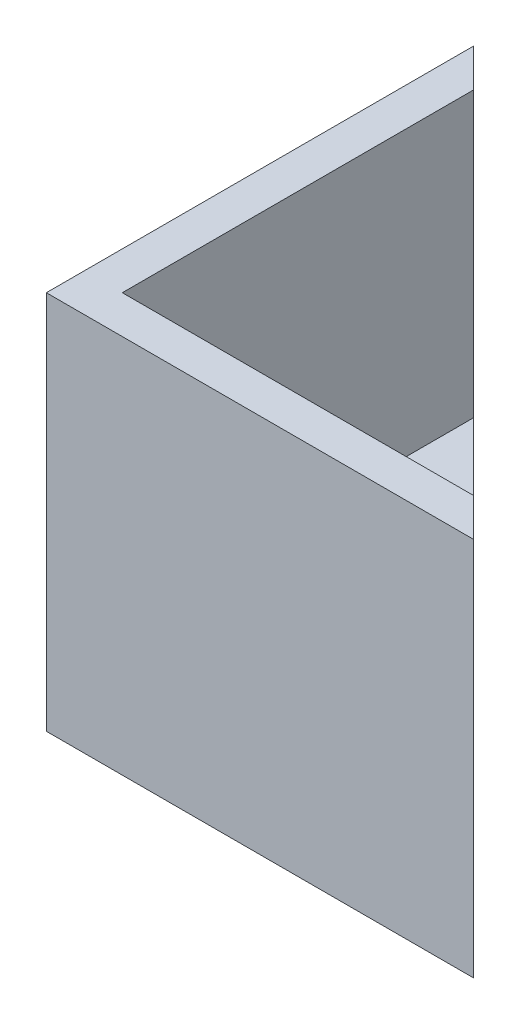
ISO-10303-21;
HEADER;
FILE_DESCRIPTION(('STEP AP214'),'2;1');
FILE_NAME('part.step','',(''),(''),'','','');
FILE_SCHEMA(('AUTOMOTIVE_DESIGN { 1 0 10303 214 1 1 1 1 }'));
ENDSEC;
DATA;
#1=APPLICATION_CONTEXT('core data for automotive mechanical design processes');
#2=APPLICATION_PROTOCOL_DEFINITION('international standard','automotive_design',2000,#1);
#3=PRODUCT_CONTEXT('',#1,'mechanical');
#4=PRODUCT('Part','Part','',(#3));
#5=PRODUCT_RELATED_PRODUCT_CATEGORY('part','',(#4));
#6=PRODUCT_DEFINITION_FORMATION('','',#4);
#7=PRODUCT_DEFINITION_CONTEXT('part definition',#1,'design');
#8=PRODUCT_DEFINITION('design','',#6,#7);
#9=PRODUCT_DEFINITION_SHAPE('','',#8);
#10=(LENGTH_UNIT() NAMED_UNIT(*) SI_UNIT(.MILLI.,.METRE.));
#11=(NAMED_UNIT(*) PLANE_ANGLE_UNIT() SI_UNIT($,.RADIAN.));
#12=(NAMED_UNIT(*) SI_UNIT($,.STERADIAN.) SOLID_ANGLE_UNIT());
#13=UNCERTAINTY_MEASURE_WITH_UNIT(LENGTH_MEASURE(1.E-05),#10,'distance_accuracy_value','');
#14=(GEOMETRIC_REPRESENTATION_CONTEXT(3) GLOBAL_UNCERTAINTY_ASSIGNED_CONTEXT((#13)) GLOBAL_UNIT_ASSIGNED_CONTEXT((#10,
#11,#12)) REPRESENTATION_CONTEXT('',''));
#15=CARTESIAN_POINT('',(0.,0.,0.));
#16=DIRECTION('',(0.,0.,1.));
#17=DIRECTION('',(1.,0.,0.));
#18=AXIS2_PLACEMENT_3D('',#15,#16,#17);
#19=CARTESIAN_POINT('',(0.,10.1,0.));
#20=DIRECTION('',(0.,1.,0.));
#21=DIRECTION('',(0.,0.,1.));
#22=AXIS2_PLACEMENT_3D('',#19,#20,#21);
#23=PLANE('',#22);
#24=DIRECTION('',(-0.707106781186548,0.,-0.707106781186547));
#25=VECTOR('',#24,1.);
#26=CARTESIAN_POINT('',(12.5355339059327,10.1,-28.221825406948));
#27=LINE('',#26,#25);
#28=CARTESIAN_POINT('',(28.221825406948,10.1,-12.5355339059327));
#29=VERTEX_POINT('',#28);
#30=CARTESIAN_POINT('',(12.5355339059327,10.1,-28.221825406948));
#31=VERTEX_POINT('',#30);
#32=EDGE_CURVE('E180',#29,#31,#27,.T.);
#33=ORIENTED_EDGE('',*,*,#32,.F.);
#34=CARTESIAN_POINT('',(24.6862915010152,10.1,-9.));
#35=DIRECTION('',(0.,1.,0.));
#36=DIRECTION('',(0.,0.,1.));
#37=AXIS2_PLACEMENT_3D('',#34,#35,#36);
#38=CIRCLE('',#37,5.);
#39=CARTESIAN_POINT('',(24.6862915010152,10.1,-4.));
#40=VERTEX_POINT('',#39);
#41=EDGE_CURVE('E195',#40,#29,#38,.T.);
#42=ORIENTED_EDGE('',*,*,#41,.F.);
#43=DIRECTION('',(-1.,0.,0.));
#44=VECTOR('',#43,1.);
#45=CARTESIAN_POINT('',(41.,10.1,-4.));
#46=LINE('',#45,#44);
#47=CARTESIAN_POINT('',(41.,10.1,-4.));
#48=VERTEX_POINT('',#47);
#49=EDGE_CURVE('E226',#48,#40,#46,.T.);
#50=ORIENTED_EDGE('',*,*,#49,.F.);
#51=DIRECTION('',(-0.707106781186548,0.,-0.707106781186548));
#52=VECTOR('',#51,1.);
#53=CARTESIAN_POINT('',(45.,10.1,0.));
#54=LINE('',#53,#52);
#55=CARTESIAN_POINT('',(4.,10.1,-41.));
#56=VERTEX_POINT('',#55);
#57=EDGE_CURVE('E241',#48,#56,#54,.T.);
#58=ORIENTED_EDGE('',*,*,#57,.T.);
#59=DIRECTION('',(0.,0.,-1.));
#60=VECTOR('',#59,1.);
#61=CARTESIAN_POINT('',(4.,10.1,-4.));
#62=LINE('',#61,#60);
#63=CARTESIAN_POINT('',(4.,10.1,-24.6862915010152));
#64=VERTEX_POINT('',#63);
#65=EDGE_CURVE('E229',#64,#56,#62,.T.);
#66=ORIENTED_EDGE('',*,*,#65,.F.);
#67=CARTESIAN_POINT('',(9.,10.1,-24.6862915010152));
#68=DIRECTION('',(0.,1.,0.));
#69=DIRECTION('',(0.,0.,1.));
#70=AXIS2_PLACEMENT_3D('',#67,#68,#69);
#71=CIRCLE('',#70,4.99999999999999);
#72=EDGE_CURVE('E190',#31,#64,#71,.T.);
#73=ORIENTED_EDGE('',*,*,#72,.F.);
#74=EDGE_LOOP('',(#33,#42,#50,#58,#66,#73));
#75=FACE_BOUND('',#74,.T.);
#76=ADVANCED_FACE('F41',(#75),#23,.T.);
#77=CARTESIAN_POINT('',(0.,10.1,-45.));
#78=DIRECTION('',(1.,0.,0.));
#79=DIRECTION('',(0.,0.,-1.));
#80=AXIS2_PLACEMENT_3D('',#77,#78,#79);
#81=PLANE('',#80);
#82=DIRECTION('',(0.,0.,1.));
#83=VECTOR('',#82,1.);
#84=CARTESIAN_POINT('',(0.,0.,-45.));
#85=LINE('',#84,#83);
#86=CARTESIAN_POINT('',(0.,0.,-45.));
#87=VERTEX_POINT('',#86);
#88=CARTESIAN_POINT('',(0.,0.,0.));
#89=VERTEX_POINT('',#88);
#90=EDGE_CURVE('E240',#87,#89,#85,.T.);
#91=ORIENTED_EDGE('',*,*,#90,.T.);
#92=DIRECTION('',(0.,-1.,0.));
#93=VECTOR('',#92,1.);
#94=CARTESIAN_POINT('',(0.,10.1,0.));
#95=LINE('',#94,#93);
#96=CARTESIAN_POINT('',(0.,40.,0.));
#97=VERTEX_POINT('',#96);
#98=EDGE_CURVE('E256',#97,#89,#95,.T.);
#99=ORIENTED_EDGE('',*,*,#98,.F.);
#100=DIRECTION('',(0.,0.,1.));
#101=VECTOR('',#100,1.);
#102=CARTESIAN_POINT('',(0.,40.,-45.));
#103=LINE('',#102,#101);
#104=CARTESIAN_POINT('',(0.,40.,-45.));
#105=VERTEX_POINT('',#104);
#106=EDGE_CURVE('E209',#105,#97,#103,.T.);
#107=ORIENTED_EDGE('',*,*,#106,.F.);
#108=DIRECTION('',(0.,-1.,0.));
#109=VECTOR('',#108,1.);
#110=CARTESIAN_POINT('',(0.,10.1,-45.));
#111=LINE('',#110,#109);
#112=EDGE_CURVE('E244',#105,#87,#111,.T.);
#113=ORIENTED_EDGE('',*,*,#112,.T.);
#114=EDGE_LOOP('',(#91,#99,#107,#113));
#115=FACE_BOUND('',#114,.T.);
#116=ADVANCED_FACE('F43',(#115),#81,.F.);
#117=CARTESIAN_POINT('',(0.,10.1,0.));
#118=DIRECTION('',(0.,0.,-1.));
#119=DIRECTION('',(-1.,0.,0.));
#120=AXIS2_PLACEMENT_3D('',#117,#118,#119);
#121=PLANE('',#120);
#122=DIRECTION('',(1.,0.,0.));
#123=VECTOR('',#122,1.);
#124=CARTESIAN_POINT('',(0.,0.,0.));
#125=LINE('',#124,#123);
#126=CARTESIAN_POINT('',(45.,0.,0.));
#127=VERTEX_POINT('',#126);
#128=EDGE_CURVE('E248',#89,#127,#125,.T.);
#129=ORIENTED_EDGE('',*,*,#128,.T.);
#130=DIRECTION('',(0.,-1.,0.));
#131=VECTOR('',#130,1.);
#132=CARTESIAN_POINT('',(45.,10.1,0.));
#133=LINE('',#132,#131);
#134=CARTESIAN_POINT('',(45.,40.,0.));
#135=VERTEX_POINT('',#134);
#136=EDGE_CURVE('E253',#135,#127,#133,.T.);
#137=ORIENTED_EDGE('',*,*,#136,.F.);
#138=DIRECTION('',(1.,0.,0.));
#139=VECTOR('',#138,1.);
#140=CARTESIAN_POINT('',(0.,40.,0.));
#141=LINE('',#140,#139);
#142=EDGE_CURVE('E212',#97,#135,#141,.T.);
#143=ORIENTED_EDGE('',*,*,#142,.F.);
#144=ORIENTED_EDGE('',*,*,#98,.T.);
#145=EDGE_LOOP('',(#129,#137,#143,#144));
#146=FACE_BOUND('',#145,.T.);
#147=ADVANCED_FACE('F285',(#146),#121,.F.);
#148=CARTESIAN_POINT('',(45.,10.1,0.));
#149=DIRECTION('',(-0.707106781186548,0.,0.707106781186548));
#150=DIRECTION('',(0.707106781186548,0.,0.707106781186548));
#151=AXIS2_PLACEMENT_3D('',#148,#149,#150);
#152=PLANE('',#151);
#153=DIRECTION('',(-0.707106781186548,0.,-0.707106781186548));
#154=VECTOR('',#153,1.);
#155=CARTESIAN_POINT('',(45.,0.,0.));
#156=LINE('',#155,#154);
#157=EDGE_CURVE('E245',#127,#87,#156,.T.);
#158=ORIENTED_EDGE('',*,*,#157,.T.);
#159=ORIENTED_EDGE('',*,*,#112,.F.);
#160=DIRECTION('',(-0.707106781186548,0.,-0.707106781186547));
#161=VECTOR('',#160,1.);
#162=CARTESIAN_POINT('',(4.,40.,-41.));
#163=LINE('',#162,#161);
#164=CARTESIAN_POINT('',(4.,40.,-41.));
#165=VERTEX_POINT('',#164);
#166=EDGE_CURVE('E222',#165,#105,#163,.T.);
#167=ORIENTED_EDGE('',*,*,#166,.F.);
#168=DIRECTION('',(0.,-1.,0.));
#169=VECTOR('',#168,1.);
#170=CARTESIAN_POINT('',(4.,40.,-41.));
#171=LINE('',#170,#169);
#172=EDGE_CURVE('E225',#165,#56,#171,.T.);
#173=ORIENTED_EDGE('',*,*,#172,.T.);
#174=ORIENTED_EDGE('',*,*,#57,.F.);
#175=DIRECTION('',(0.,-1.,0.));
#176=VECTOR('',#175,1.);
#177=CARTESIAN_POINT('',(41.,40.,-4.));
#178=LINE('',#177,#176);
#179=CARTESIAN_POINT('',(41.,40.,-4.));
#180=VERTEX_POINT('',#179);
#181=EDGE_CURVE('E237',#180,#48,#178,.T.);
#182=ORIENTED_EDGE('',*,*,#181,.F.);
#183=DIRECTION('',(-0.707106781186548,0.,-0.707106781186547));
#184=VECTOR('',#183,1.);
#185=CARTESIAN_POINT('',(45.,40.,0.));
#186=LINE('',#185,#184);
#187=EDGE_CURVE('E216',#135,#180,#186,.T.);
#188=ORIENTED_EDGE('',*,*,#187,.F.);
#189=ORIENTED_EDGE('',*,*,#136,.T.);
#190=EDGE_LOOP('',(#158,#159,#167,#173,#174,#182,#188,#189));
#191=FACE_BOUND('',#190,.T.);
#192=ADVANCED_FACE('F291',(#191),#152,.F.);
#193=CARTESIAN_POINT('',(5.46446609406727,10.1,-21.1507575950825));
#194=VERTEX_POINT('',#193);
#195=EDGE_CURVE('E171',#64,#194,#71,.T.);
#196=ORIENTED_EDGE('',*,*,#195,.F.);
#197=CARTESIAN_POINT('',(4.,10.1,-4.));
#198=VERTEX_POINT('',#197);
#199=EDGE_CURVE('E213',#198,#64,#62,.T.);
#200=ORIENTED_EDGE('',*,*,#199,.F.);
#201=EDGE_CURVE('E202',#40,#198,#46,.T.);
#202=ORIENTED_EDGE('',*,*,#201,.F.);
#203=CARTESIAN_POINT('',(21.1507575950825,10.1,-5.46446609406727));
#204=VERTEX_POINT('',#203);
#205=EDGE_CURVE('E196',#204,#40,#38,.T.);
#206=ORIENTED_EDGE('',*,*,#205,.F.);
#207=DIRECTION('',(0.707106781186547,0.,0.707106781186547));
#208=VECTOR('',#207,1.);
#209=CARTESIAN_POINT('',(5.46446609406727,10.1,-21.1507575950825));
#210=LINE('',#209,#208);
#211=EDGE_CURVE('E192',#194,#204,#210,.T.);
#212=ORIENTED_EDGE('',*,*,#211,.F.);
#213=EDGE_LOOP('',(#196,#200,#202,#206,#212));
#214=FACE_BOUND('',#213,.T.);
#215=ADVANCED_FACE('F281',(#214),#23,.T.);
#216=CARTESIAN_POINT('',(0.,0.,0.));
#217=DIRECTION('',(0.,1.,0.));
#218=DIRECTION('',(0.,0.,1.));
#219=AXIS2_PLACEMENT_3D('',#216,#217,#218);
#220=PLANE('',#219);
#221=DIRECTION('',(-0.707106781186547,0.,-0.707106781186547));
#222=VECTOR('',#221,1.);
#223=CARTESIAN_POINT('',(10.944543648263,0.,-26.6308351492782));
#224=LINE('',#223,#222);
#225=CARTESIAN_POINT('',(26.6308351492783,0.,-10.944543648263));
#226=VERTEX_POINT('',#225);
#227=CARTESIAN_POINT('',(10.944543648263,0.,-26.6308351492782));
#228=VERTEX_POINT('',#227);
#229=EDGE_CURVE('E155',#226,#228,#224,.T.);
#230=ORIENTED_EDGE('',*,*,#229,.T.);
#231=CARTESIAN_POINT('',(9.,0.,-24.6862915010152));
#232=DIRECTION('',(0.,1.,0.));
#233=DIRECTION('',(0.,0.,1.));
#234=AXIS2_PLACEMENT_3D('',#231,#232,#233);
#235=CIRCLE('',#234,2.75);
#236=CARTESIAN_POINT('',(7.055456351737,0.,-22.7417478527522));
#237=VERTEX_POINT('',#236);
#238=EDGE_CURVE('E150',#228,#237,#235,.T.);
#239=ORIENTED_EDGE('',*,*,#238,.T.);
#240=DIRECTION('',(0.707106781186548,0.,0.707106781186547));
#241=VECTOR('',#240,1.);
#242=CARTESIAN_POINT('',(7.055456351737,0.,-22.7417478527522));
#243=LINE('',#242,#241);
#244=CARTESIAN_POINT('',(22.7417478527522,0.,-7.055456351737));
#245=VERTEX_POINT('',#244);
#246=EDGE_CURVE('E158',#237,#245,#243,.T.);
#247=ORIENTED_EDGE('',*,*,#246,.T.);
#248=CARTESIAN_POINT('',(24.6862915010152,0.,-9.));
#249=DIRECTION('',(0.,1.,0.));
#250=DIRECTION('',(0.,0.,1.));
#251=AXIS2_PLACEMENT_3D('',#248,#249,#250);
#252=CIRCLE('',#251,2.75);
#253=EDGE_CURVE('E56',#245,#226,#252,.T.);
#254=ORIENTED_EDGE('',*,*,#253,.T.);
#255=EDGE_LOOP('',(#230,#239,#247,#254));
#256=FACE_BOUND('',#255,.T.);
#257=ORIENTED_EDGE('',*,*,#90,.F.);
#258=ORIENTED_EDGE('',*,*,#157,.F.);
#259=ORIENTED_EDGE('',*,*,#128,.F.);
#260=EDGE_LOOP('',(#257,#258,#259));
#261=FACE_BOUND('',#260,.T.);
#262=ADVANCED_FACE('F162',(#256,#261),#220,.F.);
#263=CARTESIAN_POINT('',(41.,40.,-4.));
#264=DIRECTION('',(0.,0.,1.));
#265=DIRECTION('',(1.,0.,0.));
#266=AXIS2_PLACEMENT_3D('',#263,#264,#265);
#267=PLANE('',#266);
#268=ORIENTED_EDGE('',*,*,#49,.T.);
#269=ORIENTED_EDGE('',*,*,#201,.T.);
#270=DIRECTION('',(0.,-1.,0.));
#271=VECTOR('',#270,1.);
#272=CARTESIAN_POINT('',(4.,40.,-4.));
#273=LINE('',#272,#271);
#274=CARTESIAN_POINT('',(4.,40.,-4.));
#275=VERTEX_POINT('',#274);
#276=EDGE_CURVE('E234',#275,#198,#273,.T.);
#277=ORIENTED_EDGE('',*,*,#276,.F.);
#278=DIRECTION('',(-1.,0.,0.));
#279=VECTOR('',#278,1.);
#280=CARTESIAN_POINT('',(41.,40.,-4.));
#281=LINE('',#280,#279);
#282=EDGE_CURVE('E218',#180,#275,#281,.T.);
#283=ORIENTED_EDGE('',*,*,#282,.F.);
#284=ORIENTED_EDGE('',*,*,#181,.T.);
#285=EDGE_LOOP('',(#268,#269,#277,#283,#284));
#286=FACE_BOUND('',#285,.T.);
#287=ADVANCED_FACE('F297',(#286),#267,.F.);
#288=CARTESIAN_POINT('',(4.,40.,-4.));
#289=DIRECTION('',(-1.,0.,0.));
#290=DIRECTION('',(0.,0.,1.));
#291=AXIS2_PLACEMENT_3D('',#288,#289,#290);
#292=PLANE('',#291);
#293=ORIENTED_EDGE('',*,*,#199,.T.);
#294=ORIENTED_EDGE('',*,*,#65,.T.);
#295=ORIENTED_EDGE('',*,*,#172,.F.);
#296=DIRECTION('',(0.,0.,-1.));
#297=VECTOR('',#296,1.);
#298=CARTESIAN_POINT('',(4.,40.,-4.));
#299=LINE('',#298,#297);
#300=EDGE_CURVE('E220',#275,#165,#299,.T.);
#301=ORIENTED_EDGE('',*,*,#300,.F.);
#302=ORIENTED_EDGE('',*,*,#276,.T.);
#303=EDGE_LOOP('',(#293,#294,#295,#301,#302));
#304=FACE_BOUND('',#303,.T.);
#305=ADVANCED_FACE('F312',(#304),#292,.F.);
#306=CARTESIAN_POINT('',(0.,40.,0.));
#307=DIRECTION('',(0.,1.,0.));
#308=DIRECTION('',(0.,0.,1.));
#309=AXIS2_PLACEMENT_3D('',#306,#307,#308);
#310=PLANE('',#309);
#311=ORIENTED_EDGE('',*,*,#106,.T.);
#312=ORIENTED_EDGE('',*,*,#142,.T.);
#313=ORIENTED_EDGE('',*,*,#187,.T.);
#314=ORIENTED_EDGE('',*,*,#282,.T.);
#315=ORIENTED_EDGE('',*,*,#300,.T.);
#316=ORIENTED_EDGE('',*,*,#166,.T.);
#317=EDGE_LOOP('',(#311,#312,#313,#314,#315,#316));
#318=FACE_BOUND('',#317,.T.);
#319=ADVANCED_FACE('F330',(#318),#310,.T.);
#320=CARTESIAN_POINT('',(9.,4.,-24.6862915010152));
#321=DIRECTION('',(0.,1.,0.));
#322=DIRECTION('',(0.,0.,1.));
#323=AXIS2_PLACEMENT_3D('',#320,#321,#322);
#324=CYLINDRICAL_SURFACE('',#323,4.99999999999999);
#325=ORIENTED_EDGE('',*,*,#72,.T.);
#326=ORIENTED_EDGE('',*,*,#195,.T.);
#327=DIRECTION('',(0.,1.,0.));
#328=VECTOR('',#327,1.);
#329=CARTESIAN_POINT('',(5.46446609406727,4.,-21.1507575950825));
#330=LINE('',#329,#328);
#331=CARTESIAN_POINT('',(5.46446609406727,4.,-21.1507575950825));
#332=VERTEX_POINT('',#331);
#333=EDGE_CURVE('E189',#332,#194,#330,.T.);
#334=ORIENTED_EDGE('',*,*,#333,.F.);
#335=CARTESIAN_POINT('',(9.,4.,-24.6862915010152));
#336=DIRECTION('',(0.,1.,0.));
#337=DIRECTION('',(0.,0.,1.));
#338=AXIS2_PLACEMENT_3D('',#335,#336,#337);
#339=CIRCLE('',#338,4.99999999999999);
#340=CARTESIAN_POINT('',(12.5355339059327,4.,-28.221825406948));
#341=VERTEX_POINT('',#340);
#342=EDGE_CURVE('E176',#341,#332,#339,.T.);
#343=ORIENTED_EDGE('',*,*,#342,.F.);
#344=DIRECTION('',(0.,1.,0.));
#345=VECTOR('',#344,1.);
#346=CARTESIAN_POINT('',(12.5355339059327,4.,-28.221825406948));
#347=LINE('',#346,#345);
#348=EDGE_CURVE('E200',#341,#31,#347,.T.);
#349=ORIENTED_EDGE('',*,*,#348,.T.);
#350=EDGE_LOOP('',(#325,#326,#334,#343,#349));
#351=FACE_BOUND('',#350,.T.);
#352=ADVANCED_FACE('F328',(#351),#324,.F.);
#353=CARTESIAN_POINT('',(12.5355339059327,4.,-28.221825406948));
#354=DIRECTION('',(0.707106781186547,0.,-0.707106781186548));
#355=DIRECTION('',(-0.707106781186548,0.,-0.707106781186547));
#356=AXIS2_PLACEMENT_3D('',#353,#354,#355);
#357=PLANE('',#356);
#358=ORIENTED_EDGE('',*,*,#32,.T.);
#359=ORIENTED_EDGE('',*,*,#348,.F.);
#360=DIRECTION('',(-0.707106781186548,0.,-0.707106781186547));
#361=VECTOR('',#360,1.);
#362=CARTESIAN_POINT('',(12.5355339059327,4.,-28.221825406948));
#363=LINE('',#362,#361);
#364=CARTESIAN_POINT('',(28.221825406948,4.,-12.5355339059327));
#365=VERTEX_POINT('',#364);
#366=EDGE_CURVE('E186',#365,#341,#363,.T.);
#367=ORIENTED_EDGE('',*,*,#366,.F.);
#368=DIRECTION('',(0.,1.,0.));
#369=VECTOR('',#368,1.);
#370=CARTESIAN_POINT('',(28.221825406948,4.,-12.5355339059327));
#371=LINE('',#370,#369);
#372=EDGE_CURVE('E203',#365,#29,#371,.T.);
#373=ORIENTED_EDGE('',*,*,#372,.T.);
#374=EDGE_LOOP('',(#358,#359,#367,#373));
#375=FACE_BOUND('',#374,.T.);
#376=ADVANCED_FACE('F322',(#375),#357,.F.);
#377=CARTESIAN_POINT('',(24.6862915010152,4.,-9.));
#378=DIRECTION('',(0.,1.,0.));
#379=DIRECTION('',(0.,0.,1.));
#380=AXIS2_PLACEMENT_3D('',#377,#378,#379);
#381=CYLINDRICAL_SURFACE('',#380,5.);
#382=ORIENTED_EDGE('',*,*,#205,.T.);
#383=ORIENTED_EDGE('',*,*,#41,.T.);
#384=ORIENTED_EDGE('',*,*,#372,.F.);
#385=CARTESIAN_POINT('',(24.6862915010152,4.,-9.));
#386=DIRECTION('',(0.,1.,0.));
#387=DIRECTION('',(0.,0.,1.));
#388=AXIS2_PLACEMENT_3D('',#385,#386,#387);
#389=CIRCLE('',#388,5.);
#390=CARTESIAN_POINT('',(21.1507575950825,4.,-5.46446609406727));
#391=VERTEX_POINT('',#390);
#392=EDGE_CURVE('E183',#391,#365,#389,.T.);
#393=ORIENTED_EDGE('',*,*,#392,.F.);
#394=DIRECTION('',(0.,1.,0.));
#395=VECTOR('',#394,1.);
#396=CARTESIAN_POINT('',(21.1507575950825,4.,-5.46446609406727));
#397=LINE('',#396,#395);
#398=EDGE_CURVE('E206',#391,#204,#397,.T.);
#399=ORIENTED_EDGE('',*,*,#398,.T.);
#400=EDGE_LOOP('',(#382,#383,#384,#393,#399));
#401=FACE_BOUND('',#400,.T.);
#402=ADVANCED_FACE('F319',(#401),#381,.F.);
#403=CARTESIAN_POINT('',(5.46446609406727,4.,-21.1507575950825));
#404=DIRECTION('',(-0.707106781186547,0.,0.707106781186547));
#405=DIRECTION('',(0.707106781186548,0.,0.707106781186548));
#406=AXIS2_PLACEMENT_3D('',#403,#404,#405);
#407=PLANE('',#406);
#408=ORIENTED_EDGE('',*,*,#211,.T.);
#409=ORIENTED_EDGE('',*,*,#398,.F.);
#410=DIRECTION('',(0.707106781186547,0.,0.707106781186547));
#411=VECTOR('',#410,1.);
#412=CARTESIAN_POINT('',(5.46446609406727,4.,-21.1507575950825));
#413=LINE('',#412,#411);
#414=EDGE_CURVE('E179',#332,#391,#413,.T.);
#415=ORIENTED_EDGE('',*,*,#414,.F.);
#416=ORIENTED_EDGE('',*,*,#333,.T.);
#417=EDGE_LOOP('',(#408,#409,#415,#416));
#418=FACE_BOUND('',#417,.T.);
#419=ADVANCED_FACE('F327',(#418),#407,.F.);
#420=CARTESIAN_POINT('',(9.,4.,-24.6862915010152));
#421=DIRECTION('',(0.,1.,0.));
#422=DIRECTION('',(0.,0.,1.));
#423=AXIS2_PLACEMENT_3D('',#420,#421,#422);
#424=PLANE('',#423);
#425=CARTESIAN_POINT('',(9.,4.,-24.6862915010152));
#426=DIRECTION('',(0.,1.,0.));
#427=DIRECTION('',(0.,0.,1.));
#428=AXIS2_PLACEMENT_3D('',#425,#426,#427);
#429=CIRCLE('',#428,2.75);
#430=CARTESIAN_POINT('',(10.944543648263,4.,-26.6308351492782));
#431=VERTEX_POINT('',#430);
#432=CARTESIAN_POINT('',(7.055456351737,4.,-22.7417478527522));
#433=VERTEX_POINT('',#432);
#434=EDGE_CURVE('E11',#431,#433,#429,.T.);
#435=ORIENTED_EDGE('',*,*,#434,.F.);
#436=DIRECTION('',(-0.707106781186548,0.,-0.707106781186548));
#437=VECTOR('',#436,1.);
#438=CARTESIAN_POINT('',(10.944543648263,4.,-26.6308351492782));
#439=LINE('',#438,#437);
#440=CARTESIAN_POINT('',(26.6308351492783,4.,-10.944543648263));
#441=VERTEX_POINT('',#440);
#442=EDGE_CURVE('E49',#441,#431,#439,.T.);
#443=ORIENTED_EDGE('',*,*,#442,.F.);
#444=CARTESIAN_POINT('',(24.6862915010152,4.,-9.));
#445=DIRECTION('',(0.,1.,0.));
#446=DIRECTION('',(0.,0.,1.));
#447=AXIS2_PLACEMENT_3D('',#444,#445,#446);
#448=CIRCLE('',#447,2.75);
#449=CARTESIAN_POINT('',(22.7417478527522,4.,-7.055456351737));
#450=VERTEX_POINT('',#449);
#451=EDGE_CURVE('E261',#450,#441,#448,.T.);
#452=ORIENTED_EDGE('',*,*,#451,.F.);
#453=DIRECTION('',(0.707106781186548,0.,0.707106781186547));
#454=VECTOR('',#453,1.);
#455=CARTESIAN_POINT('',(7.055456351737,4.,-22.7417478527522));
#456=LINE('',#455,#454);
#457=EDGE_CURVE('E259',#433,#450,#456,.T.);
#458=ORIENTED_EDGE('',*,*,#457,.F.);
#459=EDGE_LOOP('',(#435,#443,#452,#458));
#460=FACE_BOUND('',#459,.T.);
#461=ORIENTED_EDGE('',*,*,#342,.T.);
#462=ORIENTED_EDGE('',*,*,#414,.T.);
#463=ORIENTED_EDGE('',*,*,#392,.T.);
#464=ORIENTED_EDGE('',*,*,#366,.T.);
#465=EDGE_LOOP('',(#461,#462,#463,#464));
#466=FACE_BOUND('',#465,.T.);
#467=ADVANCED_FACE('F267',(#460,#466),#424,.T.);
#468=CARTESIAN_POINT('',(9.,0.,-24.6862915010152));
#469=DIRECTION('',(0.,1.,0.));
#470=DIRECTION('',(0.,0.,1.));
#471=AXIS2_PLACEMENT_3D('',#468,#469,#470);
#472=CYLINDRICAL_SURFACE('',#471,2.75);
#473=ORIENTED_EDGE('',*,*,#434,.T.);
#474=DIRECTION('',(0.,1.,0.));
#475=VECTOR('',#474,1.);
#476=CARTESIAN_POINT('',(7.055456351737,0.,-22.7417478527522));
#477=LINE('',#476,#475);
#478=EDGE_CURVE('E64',#237,#433,#477,.T.);
#479=ORIENTED_EDGE('',*,*,#478,.F.);
#480=ORIENTED_EDGE('',*,*,#238,.F.);
#481=DIRECTION('',(0.,1.,0.));
#482=VECTOR('',#481,1.);
#483=CARTESIAN_POINT('',(10.944543648263,0.,-26.6308351492782));
#484=LINE('',#483,#482);
#485=EDGE_CURVE('E169',#228,#431,#484,.T.);
#486=ORIENTED_EDGE('',*,*,#485,.T.);
#487=EDGE_LOOP('',(#473,#479,#480,#486));
#488=FACE_BOUND('',#487,.T.);
#489=ADVANCED_FACE('F147',(#488),#472,.F.);
#490=CARTESIAN_POINT('',(10.944543648263,0.,-26.6308351492782));
#491=DIRECTION('',(0.707106781186547,0.,-0.707106781186547));
#492=DIRECTION('',(-0.707106781186548,0.,-0.707106781186548));
#493=AXIS2_PLACEMENT_3D('',#490,#491,#492);
#494=PLANE('',#493);
#495=ORIENTED_EDGE('',*,*,#442,.T.);
#496=ORIENTED_EDGE('',*,*,#485,.F.);
#497=ORIENTED_EDGE('',*,*,#229,.F.);
#498=DIRECTION('',(0.,1.,0.));
#499=VECTOR('',#498,1.);
#500=CARTESIAN_POINT('',(26.6308351492783,0.,-10.944543648263));
#501=LINE('',#500,#499);
#502=EDGE_CURVE('E172',#226,#441,#501,.T.);
#503=ORIENTED_EDGE('',*,*,#502,.T.);
#504=EDGE_LOOP('',(#495,#496,#497,#503));
#505=FACE_BOUND('',#504,.T.);
#506=ADVANCED_FACE('F264',(#505),#494,.F.);
#507=CARTESIAN_POINT('',(24.6862915010152,0.,-9.));
#508=DIRECTION('',(0.,1.,0.));
#509=DIRECTION('',(0.,0.,1.));
#510=AXIS2_PLACEMENT_3D('',#507,#508,#509);
#511=CYLINDRICAL_SURFACE('',#510,2.75);
#512=ORIENTED_EDGE('',*,*,#451,.T.);
#513=ORIENTED_EDGE('',*,*,#502,.F.);
#514=ORIENTED_EDGE('',*,*,#253,.F.);
#515=DIRECTION('',(0.,1.,0.));
#516=VECTOR('',#515,1.);
#517=CARTESIAN_POINT('',(22.7417478527522,0.,-7.055456351737));
#518=LINE('',#517,#516);
#519=EDGE_CURVE('E154',#245,#450,#518,.T.);
#520=ORIENTED_EDGE('',*,*,#519,.T.);
#521=EDGE_LOOP('',(#512,#513,#514,#520));
#522=FACE_BOUND('',#521,.T.);
#523=ADVANCED_FACE('F269',(#522),#511,.F.);
#524=CARTESIAN_POINT('',(7.055456351737,0.,-22.7417478527522));
#525=DIRECTION('',(-0.707106781186547,0.,0.707106781186548));
#526=DIRECTION('',(0.707106781186548,0.,0.707106781186547));
#527=AXIS2_PLACEMENT_3D('',#524,#525,#526);
#528=PLANE('',#527);
#529=ORIENTED_EDGE('',*,*,#457,.T.);
#530=ORIENTED_EDGE('',*,*,#519,.F.);
#531=ORIENTED_EDGE('',*,*,#246,.F.);
#532=ORIENTED_EDGE('',*,*,#478,.T.);
#533=EDGE_LOOP('',(#529,#530,#531,#532));
#534=FACE_BOUND('',#533,.T.);
#535=ADVANCED_FACE('F159',(#534),#528,.F.);
#536=CLOSED_SHELL('',(#76,#116,#147,#192,#215,#262,#287,#305,#319,#352,#376,#402,#419,#467,#489,
#506,#523,#535));
#537=MANIFOLD_SOLID_BREP('B2',#536);
#538=ADVANCED_BREP_SHAPE_REPRESENTATION('',(#18,#537),#14);
#539=SHAPE_DEFINITION_REPRESENTATION(#9,#538);
ENDSEC;
END-ISO-10303-21;
